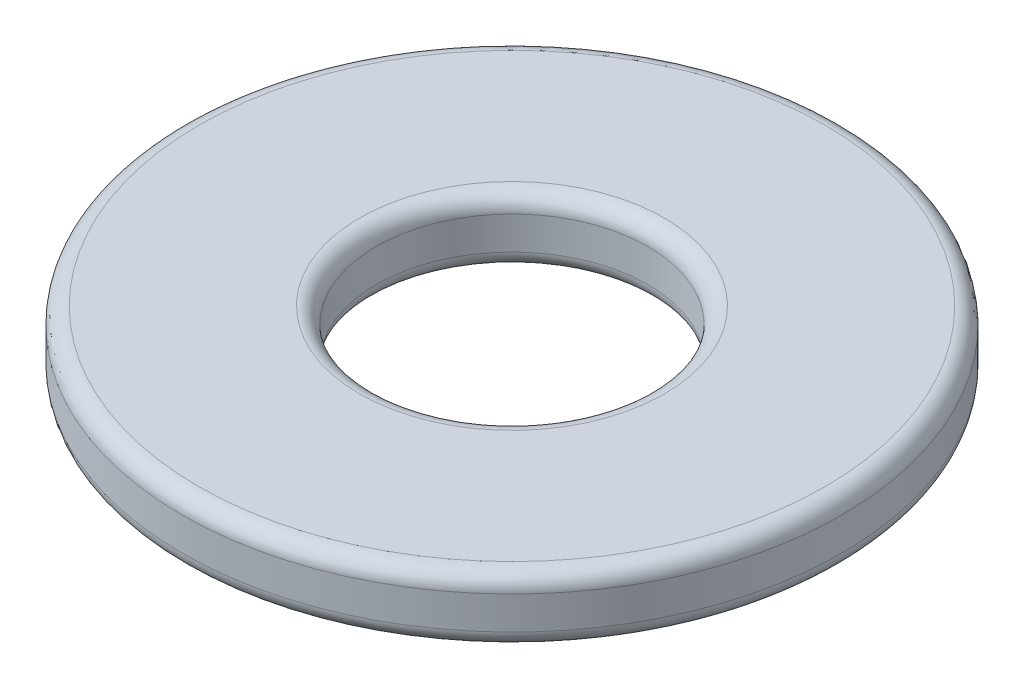
ISO-10303-21;
HEADER;
FILE_DESCRIPTION(('STEP AP214'),'2;1');
FILE_NAME('part.step','',(''),(''),'','','');
FILE_SCHEMA(('AUTOMOTIVE_DESIGN { 1 0 10303 214 1 1 1 1 }'));
ENDSEC;
DATA;
#1=APPLICATION_CONTEXT('core data for automotive mechanical design processes');
#2=APPLICATION_PROTOCOL_DEFINITION('international standard','automotive_design',2000,#1);
#3=PRODUCT_CONTEXT('',#1,'mechanical');
#4=PRODUCT('Part','Part','',(#3));
#5=PRODUCT_RELATED_PRODUCT_CATEGORY('part','',(#4));
#6=PRODUCT_DEFINITION_FORMATION('','',#4);
#7=PRODUCT_DEFINITION_CONTEXT('part definition',#1,'design');
#8=PRODUCT_DEFINITION('design','',#6,#7);
#9=PRODUCT_DEFINITION_SHAPE('','',#8);
#10=(LENGTH_UNIT() NAMED_UNIT(*) SI_UNIT(.MILLI.,.METRE.));
#11=(NAMED_UNIT(*) PLANE_ANGLE_UNIT() SI_UNIT($,.RADIAN.));
#12=(NAMED_UNIT(*) SI_UNIT($,.STERADIAN.) SOLID_ANGLE_UNIT());
#13=UNCERTAINTY_MEASURE_WITH_UNIT(LENGTH_MEASURE(1.E-05),#10,'distance_accuracy_value','');
#14=(GEOMETRIC_REPRESENTATION_CONTEXT(3) GLOBAL_UNCERTAINTY_ASSIGNED_CONTEXT((#13)) GLOBAL_UNIT_ASSIGNED_CONTEXT((#10,
#11,#12)) REPRESENTATION_CONTEXT('',''));
#15=CARTESIAN_POINT('',(0.,0.,0.));
#16=DIRECTION('',(0.,0.,1.));
#17=DIRECTION('',(1.,0.,0.));
#18=AXIS2_PLACEMENT_3D('',#15,#16,#17);
#19=CARTESIAN_POINT('',(0.,0.8,0.));
#20=DIRECTION('',(0.,1.,0.));
#21=DIRECTION('',(0.,0.,1.));
#22=AXIS2_PLACEMENT_3D('',#19,#20,#21);
#23=PLANE('',#22);
#24=CARTESIAN_POINT('',(0.,0.8,0.));
#25=DIRECTION('',(0.,1.,0.));
#26=DIRECTION('',(0.,0.,1.));
#27=AXIS2_PLACEMENT_3D('',#24,#25,#26);
#28=CIRCLE('',#27,1.85);
#29=CARTESIAN_POINT('',(0.,0.8,1.85));
#30=VERTEX_POINT('',#29);
#31=EDGE_CURVE('E44',#30,#30,#28,.F.);
#32=ORIENTED_EDGE('',*,*,#31,.T.);
#33=EDGE_LOOP('',(#32));
#34=FACE_BOUND('',#33,.T.);
#35=CARTESIAN_POINT('',(0.,0.8,0.));
#36=DIRECTION('',(0.,1.,0.));
#37=DIRECTION('',(0.,0.,1.));
#38=AXIS2_PLACEMENT_3D('',#35,#36,#37);
#39=CIRCLE('',#38,3.8);
#40=CARTESIAN_POINT('',(0.,0.8,3.8));
#41=VERTEX_POINT('',#40);
#42=EDGE_CURVE('E48',#41,#41,#39,.T.);
#43=ORIENTED_EDGE('',*,*,#42,.T.);
#44=EDGE_LOOP('',(#43));
#45=FACE_BOUND('',#44,.T.);
#46=ADVANCED_FACE('F33',(#34,#45),#23,.T.);
#47=CARTESIAN_POINT('',(0.,0.,0.));
#48=DIRECTION('',(0.,1.,0.));
#49=DIRECTION('',(0.,0.,1.));
#50=AXIS2_PLACEMENT_3D('',#47,#48,#49);
#51=PLANE('',#50);
#52=CARTESIAN_POINT('',(0.,0.,0.));
#53=DIRECTION('',(0.,1.,0.));
#54=DIRECTION('',(0.,0.,1.));
#55=AXIS2_PLACEMENT_3D('',#52,#53,#54);
#56=CIRCLE('',#55,1.85);
#57=CARTESIAN_POINT('',(0.,0.,1.85));
#58=VERTEX_POINT('',#57);
#59=EDGE_CURVE('E59',#58,#58,#56,.T.);
#60=ORIENTED_EDGE('',*,*,#59,.T.);
#61=EDGE_LOOP('',(#60));
#62=FACE_BOUND('',#61,.T.);
#63=CARTESIAN_POINT('',(0.,0.,0.));
#64=DIRECTION('',(0.,1.,0.));
#65=DIRECTION('',(0.,0.,1.));
#66=AXIS2_PLACEMENT_3D('',#63,#64,#65);
#67=CIRCLE('',#66,3.8);
#68=CARTESIAN_POINT('',(0.,0.,3.8));
#69=VERTEX_POINT('',#68);
#70=EDGE_CURVE('E62',#69,#69,#67,.F.);
#71=ORIENTED_EDGE('',*,*,#70,.T.);
#72=EDGE_LOOP('',(#71));
#73=FACE_BOUND('',#72,.T.);
#74=ADVANCED_FACE('F66',(#62,#73),#51,.F.);
#75=CARTESIAN_POINT('',(0.,0.8,0.));
#76=DIRECTION('',(0.,-1.,0.));
#77=DIRECTION('',(0.,0.,-1.));
#78=AXIS2_PLACEMENT_3D('',#75,#76,#77);
#79=CYLINDRICAL_SURFACE('',#78,4.);
#80=CARTESIAN_POINT('',(0.,0.2,0.));
#81=DIRECTION('',(0.,1.,0.));
#82=DIRECTION('',(0.,0.,1.));
#83=AXIS2_PLACEMENT_3D('',#80,#81,#82);
#84=CIRCLE('',#83,4.);
#85=CARTESIAN_POINT('',(0.,0.2,4.));
#86=VERTEX_POINT('',#85);
#87=EDGE_CURVE('E10',#86,#86,#84,.T.);
#88=ORIENTED_EDGE('',*,*,#87,.T.);
#89=EDGE_LOOP('',(#88));
#90=FACE_BOUND('',#89,.T.);
#91=CARTESIAN_POINT('',(0.,0.6,0.));
#92=DIRECTION('',(0.,1.,0.));
#93=DIRECTION('',(0.,0.,1.));
#94=AXIS2_PLACEMENT_3D('',#91,#92,#93);
#95=CIRCLE('',#94,4.);
#96=CARTESIAN_POINT('',(0.,0.6,4.));
#97=VERTEX_POINT('',#96);
#98=EDGE_CURVE('E40',#97,#97,#95,.F.);
#99=ORIENTED_EDGE('',*,*,#98,.T.);
#100=EDGE_LOOP('',(#99));
#101=FACE_BOUND('',#100,.T.);
#102=ADVANCED_FACE('F86',(#90,#101),#79,.T.);
#103=CARTESIAN_POINT('',(0.,0.8,0.));
#104=DIRECTION('',(0.,-1.,0.));
#105=DIRECTION('',(0.,0.,-1.));
#106=AXIS2_PLACEMENT_3D('',#103,#104,#105);
#107=CYLINDRICAL_SURFACE('',#106,1.65);
#108=CARTESIAN_POINT('',(0.,0.2,0.));
#109=DIRECTION('',(0.,1.,0.));
#110=DIRECTION('',(0.,0.,1.));
#111=AXIS2_PLACEMENT_3D('',#108,#109,#110);
#112=CIRCLE('',#111,1.65);
#113=CARTESIAN_POINT('',(0.,0.2,1.65));
#114=VERTEX_POINT('',#113);
#115=EDGE_CURVE('E53',#114,#114,#112,.F.);
#116=ORIENTED_EDGE('',*,*,#115,.T.);
#117=EDGE_LOOP('',(#116));
#118=FACE_BOUND('',#117,.T.);
#119=CARTESIAN_POINT('',(0.,0.6,0.));
#120=DIRECTION('',(0.,1.,0.));
#121=DIRECTION('',(0.,0.,1.));
#122=AXIS2_PLACEMENT_3D('',#119,#120,#121);
#123=CIRCLE('',#122,1.65);
#124=CARTESIAN_POINT('',(0.,0.6,1.65));
#125=VERTEX_POINT('',#124);
#126=EDGE_CURVE('E56',#125,#125,#123,.T.);
#127=ORIENTED_EDGE('',*,*,#126,.T.);
#128=EDGE_LOOP('',(#127));
#129=FACE_BOUND('',#128,.T.);
#130=ADVANCED_FACE('F91',(#118,#129),#107,.F.);
#131=CARTESIAN_POINT('',(0.,0.2,0.));
#132=DIRECTION('',(0.,1.,0.));
#133=DIRECTION('',(0.,0.,1.));
#134=AXIS2_PLACEMENT_3D('',#131,#132,#133);
#135=TOROIDAL_SURFACE('',#134,1.85,0.2);
#136=ORIENTED_EDGE('',*,*,#115,.F.);
#137=EDGE_LOOP('',(#136));
#138=FACE_BOUND('',#137,.T.);
#139=ORIENTED_EDGE('',*,*,#59,.F.);
#140=EDGE_LOOP('',(#139));
#141=FACE_BOUND('',#140,.T.);
#142=ADVANCED_FACE('F77',(#138,#141),#135,.T.);
#143=CARTESIAN_POINT('',(0.,0.6,0.));
#144=DIRECTION('',(0.,1.,0.));
#145=DIRECTION('',(0.,0.,1.));
#146=AXIS2_PLACEMENT_3D('',#143,#144,#145);
#147=TOROIDAL_SURFACE('',#146,1.85,0.2);
#148=ORIENTED_EDGE('',*,*,#31,.F.);
#149=EDGE_LOOP('',(#148));
#150=FACE_BOUND('',#149,.T.);
#151=ORIENTED_EDGE('',*,*,#126,.F.);
#152=EDGE_LOOP('',(#151));
#153=FACE_BOUND('',#152,.T.);
#154=ADVANCED_FACE('F71',(#150,#153),#147,.T.);
#155=CARTESIAN_POINT('',(0.,0.2,0.));
#156=DIRECTION('',(0.,1.,0.));
#157=DIRECTION('',(0.,0.,1.));
#158=AXIS2_PLACEMENT_3D('',#155,#156,#157);
#159=TOROIDAL_SURFACE('',#158,3.8,0.2);
#160=ORIENTED_EDGE('',*,*,#70,.F.);
#161=EDGE_LOOP('',(#160));
#162=FACE_BOUND('',#161,.T.);
#163=ORIENTED_EDGE('',*,*,#87,.F.);
#164=EDGE_LOOP('',(#163));
#165=FACE_BOUND('',#164,.T.);
#166=ADVANCED_FACE('F68',(#162,#165),#159,.T.);
#167=CARTESIAN_POINT('',(0.,0.6,0.));
#168=DIRECTION('',(0.,1.,0.));
#169=DIRECTION('',(0.,0.,1.));
#170=AXIS2_PLACEMENT_3D('',#167,#168,#169);
#171=TOROIDAL_SURFACE('',#170,3.8,0.2);
#172=ORIENTED_EDGE('',*,*,#98,.F.);
#173=EDGE_LOOP('',(#172));
#174=FACE_BOUND('',#173,.T.);
#175=ORIENTED_EDGE('',*,*,#42,.F.);
#176=EDGE_LOOP('',(#175));
#177=FACE_BOUND('',#176,.T.);
#178=ADVANCED_FACE('F35',(#174,#177),#171,.T.);
#179=CLOSED_SHELL('',(#46,#74,#102,#130,#142,#154,#166,#178));
#180=MANIFOLD_SOLID_BREP('B2',#179);
#181=ADVANCED_BREP_SHAPE_REPRESENTATION('',(#18,#180),#14);
#182=SHAPE_DEFINITION_REPRESENTATION(#9,#181);
ENDSEC;
END-ISO-10303-21;
